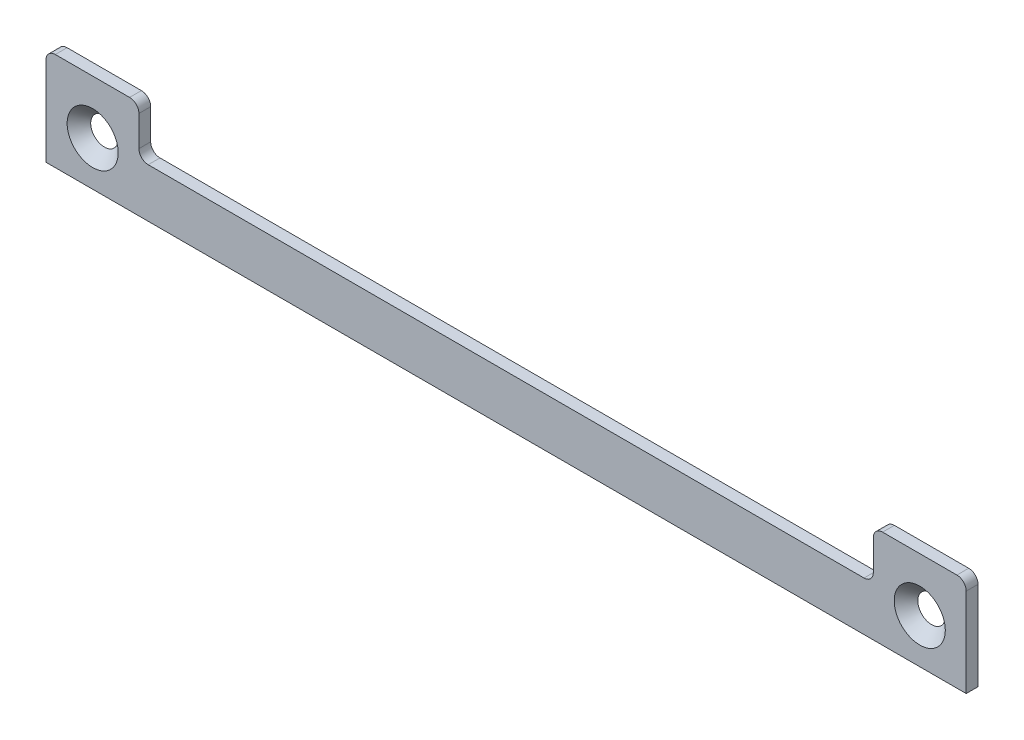
ISO-10303-21;
HEADER;
FILE_DESCRIPTION(('STEP AP214'),'2;1');
FILE_NAME('part.step','',(''),(''),'','','');
FILE_SCHEMA(('AUTOMOTIVE_DESIGN { 1 0 10303 214 1 1 1 1 }'));
ENDSEC;
DATA;
#1=APPLICATION_CONTEXT('core data for automotive mechanical design processes');
#2=APPLICATION_PROTOCOL_DEFINITION('international standard','automotive_design',2000,#1);
#3=PRODUCT_CONTEXT('',#1,'mechanical');
#4=PRODUCT('Part','Part','',(#3));
#5=PRODUCT_RELATED_PRODUCT_CATEGORY('part','',(#4));
#6=PRODUCT_DEFINITION_FORMATION('','',#4);
#7=PRODUCT_DEFINITION_CONTEXT('part definition',#1,'design');
#8=PRODUCT_DEFINITION('design','',#6,#7);
#9=PRODUCT_DEFINITION_SHAPE('','',#8);
#10=(LENGTH_UNIT() NAMED_UNIT(*) SI_UNIT(.MILLI.,.METRE.));
#11=(NAMED_UNIT(*) PLANE_ANGLE_UNIT() SI_UNIT($,.RADIAN.));
#12=(NAMED_UNIT(*) SI_UNIT($,.STERADIAN.) SOLID_ANGLE_UNIT());
#13=UNCERTAINTY_MEASURE_WITH_UNIT(LENGTH_MEASURE(1.E-05),#10,'distance_accuracy_value','');
#14=(GEOMETRIC_REPRESENTATION_CONTEXT(3) GLOBAL_UNCERTAINTY_ASSIGNED_CONTEXT((#13)) GLOBAL_UNIT_ASSIGNED_CONTEXT((#10,
#11,#12)) REPRESENTATION_CONTEXT('',''));
#15=CARTESIAN_POINT('',(0.,0.,0.));
#16=DIRECTION('',(0.,0.,1.));
#17=DIRECTION('',(1.,0.,0.));
#18=AXIS2_PLACEMENT_3D('',#15,#16,#17);
#19=CARTESIAN_POINT('',(-38.4999570142348,10.5508766118589,1.27));
#20=DIRECTION('',(1.,0.,0.));
#21=DIRECTION('',(0.,0.,-1.));
#22=AXIS2_PLACEMENT_3D('',#19,#20,#21);
#23=PLANE('',#22);
#24=DIRECTION('',(0.,-1.,0.));
#25=VECTOR('',#24,1.);
#26=CARTESIAN_POINT('',(-38.4999570142348,10.5508766118589,1.27));
#27=LINE('',#26,#25);
#28=CARTESIAN_POINT('',(-38.4999570142348,9.55087661185894,1.27));
#29=VERTEX_POINT('',#28);
#30=CARTESIAN_POINT('',(-38.4999570142348,0.,1.27));
#31=VERTEX_POINT('',#30);
#32=EDGE_CURVE('E139',#29,#31,#27,.T.);
#33=ORIENTED_EDGE('',*,*,#32,.F.);
#34=DIRECTION('',(0.,0.,-1.));
#35=VECTOR('',#34,1.);
#36=CARTESIAN_POINT('',(-38.4999570142348,9.55087661185894,1.27));
#37=LINE('',#36,#35);
#38=CARTESIAN_POINT('',(-38.4999570142348,9.55087661185894,0.));
#39=VERTEX_POINT('',#38);
#40=EDGE_CURVE('E233',#29,#39,#37,.T.);
#41=ORIENTED_EDGE('',*,*,#40,.T.);
#42=DIRECTION('',(0.,-1.,0.));
#43=VECTOR('',#42,1.);
#44=CARTESIAN_POINT('',(-38.4999570142348,10.5508766118589,0.));
#45=LINE('',#44,#43);
#46=CARTESIAN_POINT('',(-38.4999570142348,0.,0.));
#47=VERTEX_POINT('',#46);
#48=EDGE_CURVE('E165',#39,#47,#45,.T.);
#49=ORIENTED_EDGE('',*,*,#48,.T.);
#50=DIRECTION('',(0.,0.,-1.));
#51=VECTOR('',#50,1.);
#52=CARTESIAN_POINT('',(-38.4999570142348,0.,1.27));
#53=LINE('',#52,#51);
#54=EDGE_CURVE('E157',#31,#47,#53,.T.);
#55=ORIENTED_EDGE('',*,*,#54,.F.);
#56=EDGE_LOOP('',(#33,#41,#49,#55));
#57=FACE_BOUND('',#56,.T.);
#58=ADVANCED_FACE('F38',(#57),#23,.F.);
#59=CARTESIAN_POINT('',(-38.4999570142348,0.,1.27));
#60=DIRECTION('',(0.,1.,0.));
#61=DIRECTION('',(0.,0.,1.));
#62=AXIS2_PLACEMENT_3D('',#59,#60,#61);
#63=PLANE('',#62);
#64=DIRECTION('',(1.,0.,0.));
#65=VECTOR('',#64,1.);
#66=CARTESIAN_POINT('',(-38.4999570142348,0.,0.));
#67=LINE('',#66,#65);
#68=CARTESIAN_POINT('',(60.5600429857652,0.,0.));
#69=VERTEX_POINT('',#68);
#70=EDGE_CURVE('E281',#47,#69,#67,.T.);
#71=ORIENTED_EDGE('',*,*,#70,.T.);
#72=DIRECTION('',(0.,0.,-1.));
#73=VECTOR('',#72,1.);
#74=CARTESIAN_POINT('',(60.5600429857652,0.,1.27));
#75=LINE('',#74,#73);
#76=CARTESIAN_POINT('',(60.5600429857652,0.,1.27));
#77=VERTEX_POINT('',#76);
#78=EDGE_CURVE('E159',#77,#69,#75,.T.);
#79=ORIENTED_EDGE('',*,*,#78,.F.);
#80=DIRECTION('',(1.,0.,0.));
#81=VECTOR('',#80,1.);
#82=CARTESIAN_POINT('',(-38.4999570142348,0.,1.27));
#83=LINE('',#82,#81);
#84=EDGE_CURVE('E143',#31,#77,#83,.T.);
#85=ORIENTED_EDGE('',*,*,#84,.F.);
#86=ORIENTED_EDGE('',*,*,#54,.T.);
#87=EDGE_LOOP('',(#71,#79,#85,#86));
#88=FACE_BOUND('',#87,.T.);
#89=ADVANCED_FACE('F156',(#88),#63,.F.);
#90=CARTESIAN_POINT('',(60.5600429857652,0.,1.27));
#91=DIRECTION('',(-1.,0.,0.));
#92=DIRECTION('',(0.,0.,1.));
#93=AXIS2_PLACEMENT_3D('',#90,#91,#92);
#94=PLANE('',#93);
#95=DIRECTION('',(0.,1.,0.));
#96=VECTOR('',#95,1.);
#97=CARTESIAN_POINT('',(60.5600429857652,0.,0.));
#98=LINE('',#97,#96);
#99=CARTESIAN_POINT('',(60.5600429857652,9.55087661185894,0.));
#100=VERTEX_POINT('',#99);
#101=EDGE_CURVE('E285',#69,#100,#98,.T.);
#102=ORIENTED_EDGE('',*,*,#101,.T.);
#103=DIRECTION('',(0.,0.,-1.));
#104=VECTOR('',#103,1.);
#105=CARTESIAN_POINT('',(60.5600429857652,9.55087661185895,1.27));
#106=LINE('',#105,#104);
#107=CARTESIAN_POINT('',(60.5600429857652,9.55087661185894,1.27));
#108=VERTEX_POINT('',#107);
#109=EDGE_CURVE('E193',#100,#108,#106,.F.);
#110=ORIENTED_EDGE('',*,*,#109,.T.);
#111=DIRECTION('',(0.,1.,0.));
#112=VECTOR('',#111,1.);
#113=CARTESIAN_POINT('',(60.5600429857652,0.,1.27));
#114=LINE('',#113,#112);
#115=EDGE_CURVE('E162',#77,#108,#114,.T.);
#116=ORIENTED_EDGE('',*,*,#115,.F.);
#117=ORIENTED_EDGE('',*,*,#78,.T.);
#118=EDGE_LOOP('',(#102,#110,#116,#117));
#119=FACE_BOUND('',#118,.T.);
#120=ADVANCED_FACE('F304',(#119),#94,.F.);
#121=CARTESIAN_POINT('',(60.5600429857652,10.5508766118589,1.27));
#122=DIRECTION('',(0.,-1.,0.));
#123=DIRECTION('',(1.,0.,0.));
#124=AXIS2_PLACEMENT_3D('',#121,#122,#123);
#125=PLANE('',#124);
#126=DIRECTION('',(-1.,0.,0.));
#127=VECTOR('',#126,1.);
#128=CARTESIAN_POINT('',(60.5600429857652,10.5508766118589,1.27));
#129=LINE('',#128,#127);
#130=CARTESIAN_POINT('',(59.5600429857652,10.5508766118589,1.27));
#131=VERTEX_POINT('',#130);
#132=CARTESIAN_POINT('',(51.5600429857652,10.5508766118589,1.27));
#133=VERTEX_POINT('',#132);
#134=EDGE_CURVE('E308',#131,#133,#129,.T.);
#135=ORIENTED_EDGE('',*,*,#134,.F.);
#136=DIRECTION('',(0.,0.,-1.));
#137=VECTOR('',#136,1.);
#138=CARTESIAN_POINT('',(59.5600429857652,10.5508766118589,1.27));
#139=LINE('',#138,#137);
#140=CARTESIAN_POINT('',(59.5600429857652,10.5508766118589,0.));
#141=VERTEX_POINT('',#140);
#142=EDGE_CURVE('E172',#131,#141,#139,.T.);
#143=ORIENTED_EDGE('',*,*,#142,.T.);
#144=DIRECTION('',(-1.,0.,0.));
#145=VECTOR('',#144,1.);
#146=CARTESIAN_POINT('',(60.5600429857652,10.5508766118589,0.));
#147=LINE('',#146,#145);
#148=CARTESIAN_POINT('',(51.5600429857652,10.5508766118589,0.));
#149=VERTEX_POINT('',#148);
#150=EDGE_CURVE('E289',#141,#149,#147,.T.);
#151=ORIENTED_EDGE('',*,*,#150,.T.);
#152=DIRECTION('',(0.,0.,-1.));
#153=VECTOR('',#152,1.);
#154=CARTESIAN_POINT('',(51.5600429857652,10.5508766118589,1.27));
#155=LINE('',#154,#153);
#156=EDGE_CURVE('E168',#149,#133,#155,.F.);
#157=ORIENTED_EDGE('',*,*,#156,.T.);
#158=EDGE_LOOP('',(#135,#143,#151,#157));
#159=FACE_BOUND('',#158,.T.);
#160=ADVANCED_FACE('F330',(#159),#125,.F.);
#161=CARTESIAN_POINT('',(50.5600429857652,10.5508766118589,1.27));
#162=DIRECTION('',(1.,0.,0.));
#163=DIRECTION('',(0.,0.,-1.));
#164=AXIS2_PLACEMENT_3D('',#161,#162,#163);
#165=PLANE('',#164);
#166=DIRECTION('',(0.,-1.,0.));
#167=VECTOR('',#166,1.);
#168=CARTESIAN_POINT('',(50.5600429857652,10.5508766118589,1.27));
#169=LINE('',#168,#167);
#170=CARTESIAN_POINT('',(50.5600429857652,9.55087661185894,1.27));
#171=VERTEX_POINT('',#170);
#172=CARTESIAN_POINT('',(50.5600429857652,6.27543830592948,1.27));
#173=VERTEX_POINT('',#172);
#174=EDGE_CURVE('E275',#171,#173,#169,.T.);
#175=ORIENTED_EDGE('',*,*,#174,.F.);
#176=DIRECTION('',(0.,0.,-1.));
#177=VECTOR('',#176,1.);
#178=CARTESIAN_POINT('',(50.5600429857652,9.55087661185894,1.27));
#179=LINE('',#178,#177);
#180=CARTESIAN_POINT('',(50.5600429857652,9.55087661185894,0.));
#181=VERTEX_POINT('',#180);
#182=EDGE_CURVE('E209',#171,#181,#179,.T.);
#183=ORIENTED_EDGE('',*,*,#182,.T.);
#184=DIRECTION('',(0.,-1.,0.));
#185=VECTOR('',#184,1.);
#186=CARTESIAN_POINT('',(50.5600429857652,10.5508766118589,0.));
#187=LINE('',#186,#185);
#188=CARTESIAN_POINT('',(50.5600429857652,6.27543830592948,0.));
#189=VERTEX_POINT('',#188);
#190=EDGE_CURVE('E260',#181,#189,#187,.T.);
#191=ORIENTED_EDGE('',*,*,#190,.T.);
#192=DIRECTION('',(0.,0.,-1.));
#193=VECTOR('',#192,1.);
#194=CARTESIAN_POINT('',(50.5600429857652,6.27543830592948,1.27));
#195=LINE('',#194,#193);
#196=EDGE_CURVE('E206',#189,#173,#195,.F.);
#197=ORIENTED_EDGE('',*,*,#196,.T.);
#198=EDGE_LOOP('',(#175,#183,#191,#197));
#199=FACE_BOUND('',#198,.T.);
#200=ADVANCED_FACE('F324',(#199),#165,.F.);
#201=CARTESIAN_POINT('',(50.5600429857652,5.27543830592948,1.27));
#202=DIRECTION('',(0.,-1.,0.));
#203=DIRECTION('',(1.,0.,0.));
#204=AXIS2_PLACEMENT_3D('',#201,#202,#203);
#205=PLANE('',#204);
#206=DIRECTION('',(-1.,0.,0.));
#207=VECTOR('',#206,1.);
#208=CARTESIAN_POINT('',(50.5600429857652,5.27543830592948,1.27));
#209=LINE('',#208,#207);
#210=CARTESIAN_POINT('',(49.5600429857652,5.27543830592948,1.27));
#211=VERTEX_POINT('',#210);
#212=CARTESIAN_POINT('',(-27.4999570142348,5.27543830592947,1.27));
#213=VERTEX_POINT('',#212);
#214=EDGE_CURVE('E266',#211,#213,#209,.T.);
#215=ORIENTED_EDGE('',*,*,#214,.F.);
#216=DIRECTION('',(0.,0.,-1.));
#217=VECTOR('',#216,1.);
#218=CARTESIAN_POINT('',(49.5600429857652,5.27543830592948,0.));
#219=LINE('',#218,#217);
#220=CARTESIAN_POINT('',(49.5600429857652,5.27543830592948,0.));
#221=VERTEX_POINT('',#220);
#222=EDGE_CURVE('E216',#211,#221,#219,.T.);
#223=ORIENTED_EDGE('',*,*,#222,.T.);
#224=DIRECTION('',(-1.,0.,0.));
#225=VECTOR('',#224,1.);
#226=CARTESIAN_POINT('',(50.5600429857652,5.27543830592948,0.));
#227=LINE('',#226,#225);
#228=CARTESIAN_POINT('',(-27.4999570142348,5.27543830592947,0.));
#229=VERTEX_POINT('',#228);
#230=EDGE_CURVE('E248',#221,#229,#227,.T.);
#231=ORIENTED_EDGE('',*,*,#230,.T.);
#232=DIRECTION('',(0.,0.,-1.));
#233=VECTOR('',#232,1.);
#234=CARTESIAN_POINT('',(-27.4999570142348,5.27543830592947,1.27));
#235=LINE('',#234,#233);
#236=EDGE_CURVE('E213',#229,#213,#235,.F.);
#237=ORIENTED_EDGE('',*,*,#236,.T.);
#238=EDGE_LOOP('',(#215,#223,#231,#237));
#239=FACE_BOUND('',#238,.T.);
#240=ADVANCED_FACE('F256',(#239),#205,.F.);
#241=CARTESIAN_POINT('',(-28.4999570142348,5.27543830592947,1.27));
#242=DIRECTION('',(-1.,0.,0.));
#243=DIRECTION('',(0.,0.,1.));
#244=AXIS2_PLACEMENT_3D('',#241,#242,#243);
#245=PLANE('',#244);
#246=DIRECTION('',(0.,1.,0.));
#247=VECTOR('',#246,1.);
#248=CARTESIAN_POINT('',(-28.4999570142348,5.27543830592947,1.27));
#249=LINE('',#248,#247);
#250=CARTESIAN_POINT('',(-28.4999570142348,6.27543830592947,1.27));
#251=VERTEX_POINT('',#250);
#252=CARTESIAN_POINT('',(-28.4999570142348,9.55087661185894,1.27));
#253=VERTEX_POINT('',#252);
#254=EDGE_CURVE('E265',#251,#253,#249,.T.);
#255=ORIENTED_EDGE('',*,*,#254,.F.);
#256=DIRECTION('',(0.,0.,-1.));
#257=VECTOR('',#256,1.);
#258=CARTESIAN_POINT('',(-28.4999570142348,6.27543830592947,0.));
#259=LINE('',#258,#257);
#260=CARTESIAN_POINT('',(-28.4999570142348,6.27543830592947,0.));
#261=VERTEX_POINT('',#260);
#262=EDGE_CURVE('E223',#251,#261,#259,.T.);
#263=ORIENTED_EDGE('',*,*,#262,.T.);
#264=DIRECTION('',(0.,1.,0.));
#265=VECTOR('',#264,1.);
#266=CARTESIAN_POINT('',(-28.4999570142348,5.27543830592947,0.));
#267=LINE('',#266,#265);
#268=CARTESIAN_POINT('',(-28.4999570142348,9.55087661185894,0.));
#269=VERTEX_POINT('',#268);
#270=EDGE_CURVE('E250',#261,#269,#267,.T.);
#271=ORIENTED_EDGE('',*,*,#270,.T.);
#272=DIRECTION('',(0.,0.,-1.));
#273=VECTOR('',#272,1.);
#274=CARTESIAN_POINT('',(-28.4999570142348,9.55087661185894,1.27));
#275=LINE('',#274,#273);
#276=EDGE_CURVE('E220',#269,#253,#275,.F.);
#277=ORIENTED_EDGE('',*,*,#276,.T.);
#278=EDGE_LOOP('',(#255,#263,#271,#277));
#279=FACE_BOUND('',#278,.T.);
#280=ADVANCED_FACE('F268',(#279),#245,.F.);
#281=CARTESIAN_POINT('',(-28.4999570142348,10.5508766118589,1.27));
#282=DIRECTION('',(0.,-1.,0.));
#283=DIRECTION('',(0.,0.,-1.));
#284=AXIS2_PLACEMENT_3D('',#281,#282,#283);
#285=PLANE('',#284);
#286=DIRECTION('',(-1.,0.,0.));
#287=VECTOR('',#286,1.);
#288=CARTESIAN_POINT('',(-28.4999570142348,10.5508766118589,1.27));
#289=LINE('',#288,#287);
#290=CARTESIAN_POINT('',(-29.4999570142348,10.5508766118589,1.27));
#291=VERTEX_POINT('',#290);
#292=CARTESIAN_POINT('',(-37.4999570142348,10.5508766118589,1.27));
#293=VERTEX_POINT('',#292);
#294=EDGE_CURVE('E174',#291,#293,#289,.T.);
#295=ORIENTED_EDGE('',*,*,#294,.F.);
#296=DIRECTION('',(0.,0.,-1.));
#297=VECTOR('',#296,1.);
#298=CARTESIAN_POINT('',(-29.4999570142348,10.5508766118589,1.27));
#299=LINE('',#298,#297);
#300=CARTESIAN_POINT('',(-29.4999570142348,10.5508766118589,0.));
#301=VERTEX_POINT('',#300);
#302=EDGE_CURVE('E229',#291,#301,#299,.T.);
#303=ORIENTED_EDGE('',*,*,#302,.T.);
#304=DIRECTION('',(-1.,0.,0.));
#305=VECTOR('',#304,1.);
#306=CARTESIAN_POINT('',(-28.4999570142348,10.5508766118589,0.));
#307=LINE('',#306,#305);
#308=CARTESIAN_POINT('',(-37.4999570142348,10.5508766118589,0.));
#309=VERTEX_POINT('',#308);
#310=EDGE_CURVE('E152',#301,#309,#307,.T.);
#311=ORIENTED_EDGE('',*,*,#310,.T.);
#312=DIRECTION('',(0.,0.,-1.));
#313=VECTOR('',#312,1.);
#314=CARTESIAN_POINT('',(-37.4999570142348,10.5508766118589,1.27));
#315=LINE('',#314,#313);
#316=EDGE_CURVE('E54',#309,#293,#315,.F.);
#317=ORIENTED_EDGE('',*,*,#316,.T.);
#318=EDGE_LOOP('',(#295,#303,#311,#317));
#319=FACE_BOUND('',#318,.T.);
#320=ADVANCED_FACE('F299',(#319),#285,.F.);
#321=CARTESIAN_POINT('',(0.,0.,1.27));
#322=DIRECTION('',(0.,0.,1.));
#323=DIRECTION('',(1.,0.,0.));
#324=AXIS2_PLACEMENT_3D('',#321,#322,#323);
#325=PLANE('',#324);
#326=CARTESIAN_POINT('',(-33.4766172766763,4.77543830592947,1.27));
#327=DIRECTION('',(0.,0.,1.));
#328=DIRECTION('',(1.,0.,0.));
#329=AXIS2_PLACEMENT_3D('',#326,#327,#328);
#330=CIRCLE('',#329,2.75);
#331=CARTESIAN_POINT('',(-30.7266172766763,4.77543830592947,1.27));
#332=VERTEX_POINT('',#331);
#333=EDGE_CURVE('E380',#332,#332,#330,.T.);
#334=ORIENTED_EDGE('',*,*,#333,.F.);
#335=EDGE_LOOP('',(#334));
#336=FACE_BOUND('',#335,.T.);
#337=CARTESIAN_POINT('',(55.5603253937704,4.77543830592947,1.27));
#338=DIRECTION('',(0.,0.,1.));
#339=DIRECTION('',(1.,0.,0.));
#340=AXIS2_PLACEMENT_3D('',#337,#338,#339);
#341=CIRCLE('',#340,2.75);
#342=CARTESIAN_POINT('',(58.3103253937704,4.77543830592947,1.27));
#343=VERTEX_POINT('',#342);
#344=EDGE_CURVE('E384',#343,#343,#341,.T.);
#345=ORIENTED_EDGE('',*,*,#344,.F.);
#346=EDGE_LOOP('',(#345));
#347=FACE_BOUND('',#346,.T.);
#348=ORIENTED_EDGE('',*,*,#115,.T.);
#349=CARTESIAN_POINT('',(59.5600429857652,9.55087661185895,1.27));
#350=DIRECTION('',(0.,0.,1.));
#351=DIRECTION('',(1.,0.,0.));
#352=AXIS2_PLACEMENT_3D('',#349,#350,#351);
#353=CIRCLE('',#352,1.);
#354=EDGE_CURVE('E203',#108,#131,#353,.T.);
#355=ORIENTED_EDGE('',*,*,#354,.T.);
#356=ORIENTED_EDGE('',*,*,#134,.T.);
#357=CARTESIAN_POINT('',(51.5600429857652,9.55087661185894,1.27));
#358=DIRECTION('',(0.,0.,1.));
#359=DIRECTION('',(1.,0.,0.));
#360=AXIS2_PLACEMENT_3D('',#357,#358,#359);
#361=CIRCLE('',#360,1.);
#362=EDGE_CURVE('E200',#133,#171,#361,.T.);
#363=ORIENTED_EDGE('',*,*,#362,.T.);
#364=ORIENTED_EDGE('',*,*,#174,.T.);
#365=CARTESIAN_POINT('',(49.5600429857652,6.27543830592948,1.27));
#366=DIRECTION('',(0.,0.,1.));
#367=DIRECTION('',(1.,0.,0.));
#368=AXIS2_PLACEMENT_3D('',#365,#366,#367);
#369=CIRCLE('',#368,1.);
#370=EDGE_CURVE('E239',#173,#211,#369,.F.);
#371=ORIENTED_EDGE('',*,*,#370,.T.);
#372=ORIENTED_EDGE('',*,*,#214,.T.);
#373=CARTESIAN_POINT('',(-27.4999570142348,6.27543830592947,1.27));
#374=DIRECTION('',(0.,0.,1.));
#375=DIRECTION('',(1.,0.,0.));
#376=AXIS2_PLACEMENT_3D('',#373,#374,#375);
#377=CIRCLE('',#376,1.);
#378=EDGE_CURVE('E11',#213,#251,#377,.F.);
#379=ORIENTED_EDGE('',*,*,#378,.T.);
#380=ORIENTED_EDGE('',*,*,#254,.T.);
#381=CARTESIAN_POINT('',(-29.4999570142348,9.55087661185894,1.27));
#382=DIRECTION('',(0.,0.,1.));
#383=DIRECTION('',(1.,0.,0.));
#384=AXIS2_PLACEMENT_3D('',#381,#382,#383);
#385=CIRCLE('',#384,1.);
#386=EDGE_CURVE('E61',#253,#291,#385,.T.);
#387=ORIENTED_EDGE('',*,*,#386,.T.);
#388=ORIENTED_EDGE('',*,*,#294,.T.);
#389=CARTESIAN_POINT('',(-37.4999570142348,9.55087661185894,1.27));
#390=DIRECTION('',(0.,0.,1.));
#391=DIRECTION('',(1.,0.,0.));
#392=AXIS2_PLACEMENT_3D('',#389,#390,#391);
#393=CIRCLE('',#392,1.);
#394=EDGE_CURVE('E146',#293,#29,#393,.T.);
#395=ORIENTED_EDGE('',*,*,#394,.T.);
#396=ORIENTED_EDGE('',*,*,#32,.T.);
#397=ORIENTED_EDGE('',*,*,#84,.T.);
#398=EDGE_LOOP('',(#348,#355,#356,#363,#364,#371,#372,#379,#380,#387,#388,#395,#396,#397));
#399=FACE_BOUND('',#398,.T.);
#400=ADVANCED_FACE('F142',(#336,#347,#399),#325,.T.);
#401=CARTESIAN_POINT('',(0.,0.,0.));
#402=DIRECTION('',(0.,0.,1.));
#403=DIRECTION('',(1.,0.,0.));
#404=AXIS2_PLACEMENT_3D('',#401,#402,#403);
#405=PLANE('',#404);
#406=CARTESIAN_POINT('',(-33.4766172766763,4.77543830592947,0.));
#407=DIRECTION('',(0.,0.,1.));
#408=DIRECTION('',(1.,0.,0.));
#409=AXIS2_PLACEMENT_3D('',#406,#407,#408);
#410=CIRCLE('',#409,1.48);
#411=CARTESIAN_POINT('',(-31.9966172766763,4.77543830592947,0.));
#412=VERTEX_POINT('',#411);
#413=EDGE_CURVE('E377',#412,#412,#410,.T.);
#414=ORIENTED_EDGE('',*,*,#413,.T.);
#415=EDGE_LOOP('',(#414));
#416=FACE_BOUND('',#415,.T.);
#417=CARTESIAN_POINT('',(55.5603253937704,4.77543830592947,0.));
#418=DIRECTION('',(0.,0.,1.));
#419=DIRECTION('',(1.,0.,0.));
#420=AXIS2_PLACEMENT_3D('',#417,#418,#419);
#421=CIRCLE('',#420,1.48);
#422=CARTESIAN_POINT('',(57.0403253937704,4.77543830592947,0.));
#423=VERTEX_POINT('',#422);
#424=EDGE_CURVE('E282',#423,#423,#421,.T.);
#425=ORIENTED_EDGE('',*,*,#424,.T.);
#426=EDGE_LOOP('',(#425));
#427=FACE_BOUND('',#426,.T.);
#428=ORIENTED_EDGE('',*,*,#150,.F.);
#429=CARTESIAN_POINT('',(59.5600429857652,9.55087661185895,0.));
#430=DIRECTION('',(0.,0.,1.));
#431=DIRECTION('',(1.,0.,0.));
#432=AXIS2_PLACEMENT_3D('',#429,#430,#431);
#433=CIRCLE('',#432,1.);
#434=EDGE_CURVE('E190',#141,#100,#433,.F.);
#435=ORIENTED_EDGE('',*,*,#434,.T.);
#436=ORIENTED_EDGE('',*,*,#101,.F.);
#437=ORIENTED_EDGE('',*,*,#70,.F.);
#438=ORIENTED_EDGE('',*,*,#48,.F.);
#439=CARTESIAN_POINT('',(-37.4999570142348,9.55087661185894,0.));
#440=DIRECTION('',(0.,0.,1.));
#441=DIRECTION('',(1.,0.,0.));
#442=AXIS2_PLACEMENT_3D('',#439,#440,#441);
#443=CIRCLE('',#442,1.);
#444=EDGE_CURVE('E181',#39,#309,#443,.F.);
#445=ORIENTED_EDGE('',*,*,#444,.T.);
#446=ORIENTED_EDGE('',*,*,#310,.F.);
#447=CARTESIAN_POINT('',(-29.4999570142348,9.55087661185894,0.));
#448=DIRECTION('',(0.,0.,1.));
#449=DIRECTION('',(1.,0.,0.));
#450=AXIS2_PLACEMENT_3D('',#447,#448,#449);
#451=CIRCLE('',#450,1.);
#452=EDGE_CURVE('E184',#301,#269,#451,.F.);
#453=ORIENTED_EDGE('',*,*,#452,.T.);
#454=ORIENTED_EDGE('',*,*,#270,.F.);
#455=CARTESIAN_POINT('',(-27.4999570142348,6.27543830592947,0.));
#456=DIRECTION('',(0.,0.,1.));
#457=DIRECTION('',(1.,0.,0.));
#458=AXIS2_PLACEMENT_3D('',#455,#456,#457);
#459=CIRCLE('',#458,1.);
#460=EDGE_CURVE('E47',#261,#229,#459,.T.);
#461=ORIENTED_EDGE('',*,*,#460,.T.);
#462=ORIENTED_EDGE('',*,*,#230,.F.);
#463=CARTESIAN_POINT('',(49.5600429857652,6.27543830592948,0.));
#464=DIRECTION('',(0.,0.,1.));
#465=DIRECTION('',(1.,0.,0.));
#466=AXIS2_PLACEMENT_3D('',#463,#464,#465);
#467=CIRCLE('',#466,1.);
#468=EDGE_CURVE('E236',#221,#189,#467,.T.);
#469=ORIENTED_EDGE('',*,*,#468,.T.);
#470=ORIENTED_EDGE('',*,*,#190,.F.);
#471=CARTESIAN_POINT('',(51.5600429857652,9.55087661185894,0.));
#472=DIRECTION('',(0.,0.,1.));
#473=DIRECTION('',(1.,0.,0.));
#474=AXIS2_PLACEMENT_3D('',#471,#472,#473);
#475=CIRCLE('',#474,1.);
#476=EDGE_CURVE('E187',#181,#149,#475,.F.);
#477=ORIENTED_EDGE('',*,*,#476,.T.);
#478=EDGE_LOOP('',(#428,#435,#436,#437,#438,#445,#446,#453,#454,#461,#462,#469,#470,#477));
#479=FACE_BOUND('',#478,.T.);
#480=ADVANCED_FACE('F247',(#416,#427,#479),#405,.F.);
#481=CARTESIAN_POINT('',(59.5600429857652,9.55087661185895,1.27));
#482=DIRECTION('',(0.,0.,-1.));
#483=DIRECTION('',(-1.,0.,0.));
#484=AXIS2_PLACEMENT_3D('',#481,#482,#483);
#485=CYLINDRICAL_SURFACE('',#484,1.);
#486=ORIENTED_EDGE('',*,*,#354,.F.);
#487=ORIENTED_EDGE('',*,*,#109,.F.);
#488=ORIENTED_EDGE('',*,*,#434,.F.);
#489=ORIENTED_EDGE('',*,*,#142,.F.);
#490=EDGE_LOOP('',(#486,#487,#488,#489));
#491=FACE_BOUND('',#490,.T.);
#492=ADVANCED_FACE('F333',(#491),#485,.T.);
#493=CARTESIAN_POINT('',(51.5600429857652,9.55087661185894,1.27));
#494=DIRECTION('',(0.,0.,-1.));
#495=DIRECTION('',(-1.,0.,0.));
#496=AXIS2_PLACEMENT_3D('',#493,#494,#495);
#497=CYLINDRICAL_SURFACE('',#496,1.);
#498=ORIENTED_EDGE('',*,*,#362,.F.);
#499=ORIENTED_EDGE('',*,*,#156,.F.);
#500=ORIENTED_EDGE('',*,*,#476,.F.);
#501=ORIENTED_EDGE('',*,*,#182,.F.);
#502=EDGE_LOOP('',(#498,#499,#500,#501));
#503=FACE_BOUND('',#502,.T.);
#504=ADVANCED_FACE('F326',(#503),#497,.T.);
#505=CARTESIAN_POINT('',(49.5600429857652,6.27543830592948,1.27));
#506=DIRECTION('',(0.,0.,1.));
#507=DIRECTION('',(1.,0.,0.));
#508=AXIS2_PLACEMENT_3D('',#505,#506,#507);
#509=CYLINDRICAL_SURFACE('',#508,1.);
#510=ORIENTED_EDGE('',*,*,#370,.F.);
#511=ORIENTED_EDGE('',*,*,#196,.F.);
#512=ORIENTED_EDGE('',*,*,#468,.F.);
#513=ORIENTED_EDGE('',*,*,#222,.F.);
#514=EDGE_LOOP('',(#510,#511,#512,#513));
#515=FACE_BOUND('',#514,.T.);
#516=ADVANCED_FACE('F322',(#515),#509,.F.);
#517=CARTESIAN_POINT('',(-27.4999570142348,6.27543830592947,1.27));
#518=DIRECTION('',(0.,0.,1.));
#519=DIRECTION('',(1.,0.,0.));
#520=AXIS2_PLACEMENT_3D('',#517,#518,#519);
#521=CYLINDRICAL_SURFACE('',#520,1.);
#522=ORIENTED_EDGE('',*,*,#378,.F.);
#523=ORIENTED_EDGE('',*,*,#236,.F.);
#524=ORIENTED_EDGE('',*,*,#460,.F.);
#525=ORIENTED_EDGE('',*,*,#262,.F.);
#526=EDGE_LOOP('',(#522,#523,#524,#525));
#527=FACE_BOUND('',#526,.T.);
#528=ADVANCED_FACE('F263',(#527),#521,.F.);
#529=CARTESIAN_POINT('',(-29.4999570142348,9.55087661185894,1.27));
#530=DIRECTION('',(0.,0.,-1.));
#531=DIRECTION('',(-1.,0.,0.));
#532=AXIS2_PLACEMENT_3D('',#529,#530,#531);
#533=CYLINDRICAL_SURFACE('',#532,1.);
#534=ORIENTED_EDGE('',*,*,#386,.F.);
#535=ORIENTED_EDGE('',*,*,#276,.F.);
#536=ORIENTED_EDGE('',*,*,#452,.F.);
#537=ORIENTED_EDGE('',*,*,#302,.F.);
#538=EDGE_LOOP('',(#534,#535,#536,#537));
#539=FACE_BOUND('',#538,.T.);
#540=ADVANCED_FACE('F408',(#539),#533,.T.);
#541=CARTESIAN_POINT('',(-37.4999570142348,9.55087661185894,1.27));
#542=DIRECTION('',(0.,0.,-1.));
#543=DIRECTION('',(-1.,0.,0.));
#544=AXIS2_PLACEMENT_3D('',#541,#542,#543);
#545=CYLINDRICAL_SURFACE('',#544,1.);
#546=ORIENTED_EDGE('',*,*,#394,.F.);
#547=ORIENTED_EDGE('',*,*,#316,.F.);
#548=ORIENTED_EDGE('',*,*,#444,.F.);
#549=ORIENTED_EDGE('',*,*,#40,.F.);
#550=EDGE_LOOP('',(#546,#547,#548,#549));
#551=FACE_BOUND('',#550,.T.);
#552=ADVANCED_FACE('F40',(#551),#545,.T.);
#553=CARTESIAN_POINT('',(55.5603253937704,4.77543830592947,1.27));
#554=DIRECTION('',(0.,0.,1.));
#555=DIRECTION('',(1.,0.,0.));
#556=AXIS2_PLACEMENT_3D('',#553,#554,#555);
#557=CONICAL_SURFACE('',#556,2.75,0.785398163397449);
#558=ORIENTED_EDGE('',*,*,#424,.F.);
#559=EDGE_LOOP('',(#558));
#560=FACE_BOUND('',#559,.T.);
#561=ORIENTED_EDGE('',*,*,#344,.T.);
#562=EDGE_LOOP('',(#561));
#563=FACE_BOUND('',#562,.T.);
#564=ADVANCED_FACE('F365',(#560,#563),#557,.F.);
#565=CARTESIAN_POINT('',(-33.4766172766763,4.77543830592947,1.27));
#566=DIRECTION('',(0.,0.,1.));
#567=DIRECTION('',(1.,0.,0.));
#568=AXIS2_PLACEMENT_3D('',#565,#566,#567);
#569=CONICAL_SURFACE('',#568,2.75,0.785398163397447);
#570=ORIENTED_EDGE('',*,*,#413,.F.);
#571=EDGE_LOOP('',(#570));
#572=FACE_BOUND('',#571,.T.);
#573=ORIENTED_EDGE('',*,*,#333,.T.);
#574=EDGE_LOOP('',(#573));
#575=FACE_BOUND('',#574,.T.);
#576=ADVANCED_FACE('F368',(#572,#575),#569,.F.);
#577=CLOSED_SHELL('',(#58,#89,#120,#160,#200,#240,#280,#320,#400,#480,#492,#504,#516,#528,#540,
#552,#564,#576));
#578=MANIFOLD_SOLID_BREP('B2',#577);
#579=ADVANCED_BREP_SHAPE_REPRESENTATION('',(#18,#578),#14);
#580=SHAPE_DEFINITION_REPRESENTATION(#9,#579);
ENDSEC;
END-ISO-10303-21;
